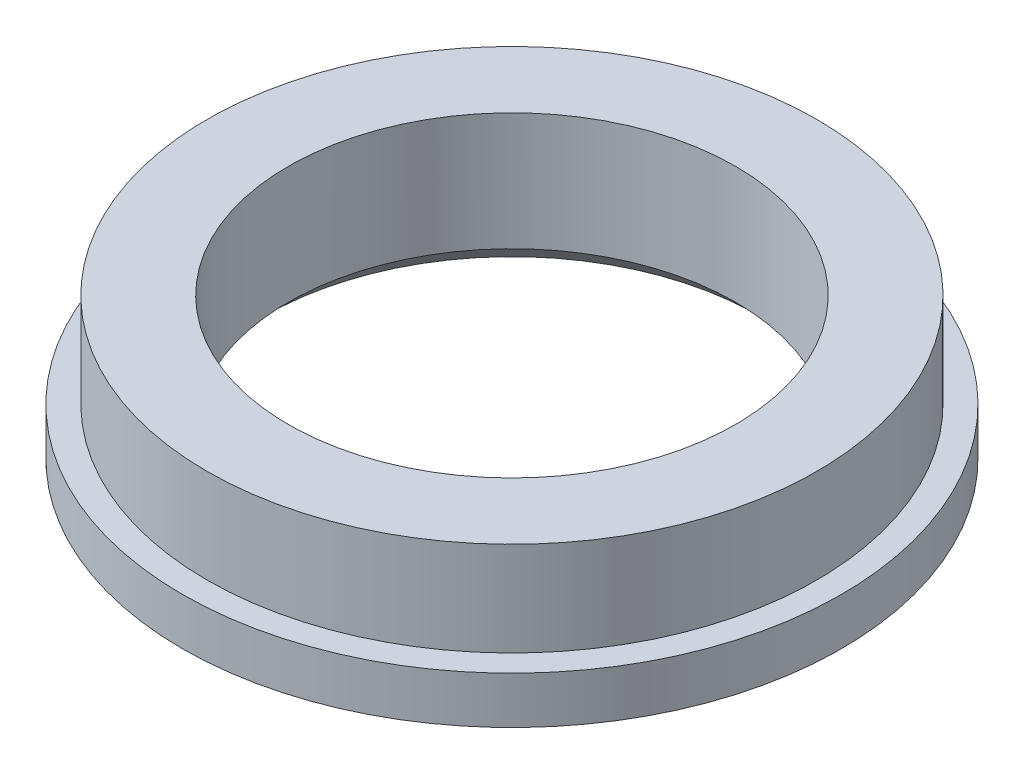
ISO-10303-21;
HEADER;
FILE_DESCRIPTION(('STEP AP214'),'2;1');
FILE_NAME('part.step','',(''),(''),'','','');
FILE_SCHEMA(('AUTOMOTIVE_DESIGN { 1 0 10303 214 1 1 1 1 }'));
ENDSEC;
DATA;
#1=APPLICATION_CONTEXT('core data for automotive mechanical design processes');
#2=APPLICATION_PROTOCOL_DEFINITION('international standard','automotive_design',2000,#1);
#3=PRODUCT_CONTEXT('',#1,'mechanical');
#4=PRODUCT('Part','Part','',(#3));
#5=PRODUCT_RELATED_PRODUCT_CATEGORY('part','',(#4));
#6=PRODUCT_DEFINITION_FORMATION('','',#4);
#7=PRODUCT_DEFINITION_CONTEXT('part definition',#1,'design');
#8=PRODUCT_DEFINITION('design','',#6,#7);
#9=PRODUCT_DEFINITION_SHAPE('','',#8);
#10=(LENGTH_UNIT() NAMED_UNIT(*) SI_UNIT(.MILLI.,.METRE.));
#11=(NAMED_UNIT(*) PLANE_ANGLE_UNIT() SI_UNIT($,.RADIAN.));
#12=(NAMED_UNIT(*) SI_UNIT($,.STERADIAN.) SOLID_ANGLE_UNIT());
#13=UNCERTAINTY_MEASURE_WITH_UNIT(LENGTH_MEASURE(1.E-05),#10,'distance_accuracy_value','');
#14=(GEOMETRIC_REPRESENTATION_CONTEXT(3) GLOBAL_UNCERTAINTY_ASSIGNED_CONTEXT((#13)) GLOBAL_UNIT_ASSIGNED_CONTEXT((#10,
#11,#12)) REPRESENTATION_CONTEXT('',''));
#15=CARTESIAN_POINT('',(0.,0.,0.));
#16=DIRECTION('',(0.,0.,1.));
#17=DIRECTION('',(1.,0.,0.));
#18=AXIS2_PLACEMENT_3D('',#15,#16,#17);
#19=CARTESIAN_POINT('',(0.,1.,0.));
#20=DIRECTION('',(0.,-1.,0.));
#21=DIRECTION('',(0.,0.,-1.));
#22=AXIS2_PLACEMENT_3D('',#19,#20,#21);
#23=CYLINDRICAL_SURFACE('',#22,7.);
#24=CARTESIAN_POINT('',(0.,1.,0.));
#25=DIRECTION('',(0.,1.,0.));
#26=DIRECTION('',(0.,0.,1.));
#27=AXIS2_PLACEMENT_3D('',#24,#25,#26);
#28=CIRCLE('',#27,7.);
#29=CARTESIAN_POINT('',(0.,1.,7.));
#30=VERTEX_POINT('',#29);
#31=EDGE_CURVE('E62',#30,#30,#28,.T.);
#32=ORIENTED_EDGE('',*,*,#31,.F.);
#33=EDGE_LOOP('',(#32));
#34=FACE_BOUND('',#33,.T.);
#35=CARTESIAN_POINT('',(0.,0.,0.));
#36=DIRECTION('',(0.,1.,0.));
#37=DIRECTION('',(0.,0.,1.));
#38=AXIS2_PLACEMENT_3D('',#35,#36,#37);
#39=CIRCLE('',#38,7.);
#40=CARTESIAN_POINT('',(0.,0.,7.));
#41=VERTEX_POINT('',#40);
#42=EDGE_CURVE('E65',#41,#41,#39,.T.);
#43=ORIENTED_EDGE('',*,*,#42,.T.);
#44=EDGE_LOOP('',(#43));
#45=FACE_BOUND('',#44,.T.);
#46=ADVANCED_FACE('F43',(#34,#45),#23,.T.);
#47=CARTESIAN_POINT('',(0.,1.,0.));
#48=DIRECTION('',(0.,1.,0.));
#49=DIRECTION('',(0.,0.,1.));
#50=AXIS2_PLACEMENT_3D('',#47,#48,#49);
#51=PLANE('',#50);
#52=CARTESIAN_POINT('',(0.,1.,0.));
#53=DIRECTION('',(0.,1.,0.));
#54=DIRECTION('',(0.,0.,1.));
#55=AXIS2_PLACEMENT_3D('',#52,#53,#54);
#56=CIRCLE('',#55,6.475);
#57=CARTESIAN_POINT('',(0.,1.,6.475));
#58=VERTEX_POINT('',#57);
#59=EDGE_CURVE('E57',#58,#58,#56,.T.);
#60=ORIENTED_EDGE('',*,*,#59,.F.);
#61=EDGE_LOOP('',(#60));
#62=FACE_BOUND('',#61,.T.);
#63=ORIENTED_EDGE('',*,*,#31,.T.);
#64=EDGE_LOOP('',(#63));
#65=FACE_BOUND('',#64,.T.);
#66=ADVANCED_FACE('F95',(#62,#65),#51,.T.);
#67=CARTESIAN_POINT('',(0.,0.,0.));
#68=DIRECTION('',(0.,1.,0.));
#69=DIRECTION('',(0.,0.,1.));
#70=AXIS2_PLACEMENT_3D('',#67,#68,#69);
#71=PLANE('',#70);
#72=CARTESIAN_POINT('',(0.,0.,0.));
#73=DIRECTION('',(0.,1.,0.));
#74=DIRECTION('',(0.,0.,1.));
#75=AXIS2_PLACEMENT_3D('',#72,#73,#74);
#76=CIRCLE('',#75,5.25);
#77=CARTESIAN_POINT('',(0.,0.,5.25));
#78=VERTEX_POINT('',#77);
#79=EDGE_CURVE('E10',#78,#78,#76,.T.);
#80=ORIENTED_EDGE('',*,*,#79,.T.);
#81=EDGE_LOOP('',(#80));
#82=FACE_BOUND('',#81,.T.);
#83=ORIENTED_EDGE('',*,*,#42,.F.);
#84=EDGE_LOOP('',(#83));
#85=FACE_BOUND('',#84,.T.);
#86=ADVANCED_FACE('F100',(#82,#85),#71,.F.);
#87=CARTESIAN_POINT('',(0.,3.,0.));
#88=DIRECTION('',(0.,-1.,0.));
#89=DIRECTION('',(0.,0.,-1.));
#90=AXIS2_PLACEMENT_3D('',#87,#88,#89);
#91=CYLINDRICAL_SURFACE('',#90,6.475);
#92=CARTESIAN_POINT('',(0.,3.,0.));
#93=DIRECTION('',(0.,1.,0.));
#94=DIRECTION('',(0.,0.,1.));
#95=AXIS2_PLACEMENT_3D('',#92,#93,#94);
#96=CIRCLE('',#95,6.475);
#97=CARTESIAN_POINT('',(0.,3.,6.475));
#98=VERTEX_POINT('',#97);
#99=EDGE_CURVE('E69',#98,#98,#96,.T.);
#100=ORIENTED_EDGE('',*,*,#99,.F.);
#101=EDGE_LOOP('',(#100));
#102=FACE_BOUND('',#101,.T.);
#103=ORIENTED_EDGE('',*,*,#59,.T.);
#104=EDGE_LOOP('',(#103));
#105=FACE_BOUND('',#104,.T.);
#106=ADVANCED_FACE('F92',(#102,#105),#91,.T.);
#107=CARTESIAN_POINT('',(0.,3.,0.));
#108=DIRECTION('',(0.,1.,0.));
#109=DIRECTION('',(0.,0.,1.));
#110=AXIS2_PLACEMENT_3D('',#107,#108,#109);
#111=PLANE('',#110);
#112=CARTESIAN_POINT('',(0.,3.,0.));
#113=DIRECTION('',(0.,-1.,0.));
#114=DIRECTION('',(0.,0.,-1.));
#115=AXIS2_PLACEMENT_3D('',#112,#113,#114);
#116=CIRCLE('',#115,4.75);
#117=CARTESIAN_POINT('',(0.,3.,-4.75));
#118=VERTEX_POINT('',#117);
#119=EDGE_CURVE('E76',#118,#118,#116,.T.);
#120=ORIENTED_EDGE('',*,*,#119,.T.);
#121=EDGE_LOOP('',(#120));
#122=FACE_BOUND('',#121,.T.);
#123=ORIENTED_EDGE('',*,*,#99,.T.);
#124=EDGE_LOOP('',(#123));
#125=FACE_BOUND('',#124,.T.);
#126=ADVANCED_FACE('F81',(#122,#125),#111,.T.);
#127=CARTESIAN_POINT('',(0.,3.,0.));
#128=DIRECTION('',(0.,-1.,0.));
#129=DIRECTION('',(0.,0.,-1.));
#130=AXIS2_PLACEMENT_3D('',#127,#128,#129);
#131=CYLINDRICAL_SURFACE('',#130,4.75);
#132=CARTESIAN_POINT('',(0.,0.499999999999999,0.));
#133=DIRECTION('',(0.,1.,0.));
#134=DIRECTION('',(0.,0.,1.));
#135=AXIS2_PLACEMENT_3D('',#132,#133,#134);
#136=CIRCLE('',#135,4.75);
#137=CARTESIAN_POINT('',(0.,0.499999999999999,4.75));
#138=VERTEX_POINT('',#137);
#139=EDGE_CURVE('E52',#138,#138,#136,.F.);
#140=ORIENTED_EDGE('',*,*,#139,.T.);
#141=EDGE_LOOP('',(#140));
#142=FACE_BOUND('',#141,.T.);
#143=ORIENTED_EDGE('',*,*,#119,.F.);
#144=EDGE_LOOP('',(#143));
#145=FACE_BOUND('',#144,.T.);
#146=ADVANCED_FACE('F84',(#142,#145),#131,.F.);
#147=CARTESIAN_POINT('',(0.,0.499999999999999,0.));
#148=DIRECTION('',(0.,-1.,0.));
#149=DIRECTION('',(0.,0.,-1.));
#150=AXIS2_PLACEMENT_3D('',#147,#148,#149);
#151=CONICAL_SURFACE('',#150,4.75,0.785398163397449);
#152=ORIENTED_EDGE('',*,*,#79,.F.);
#153=EDGE_LOOP('',(#152));
#154=FACE_BOUND('',#153,.T.);
#155=ORIENTED_EDGE('',*,*,#139,.F.);
#156=EDGE_LOOP('',(#155));
#157=FACE_BOUND('',#156,.T.);
#158=ADVANCED_FACE('F46',(#154,#157),#151,.F.);
#159=CLOSED_SHELL('',(#46,#66,#86,#106,#126,#146,#158));
#160=MANIFOLD_SOLID_BREP('B2',#159);
#161=ADVANCED_BREP_SHAPE_REPRESENTATION('',(#18,#160),#14);
#162=SHAPE_DEFINITION_REPRESENTATION(#9,#161);
ENDSEC;
END-ISO-10303-21;
